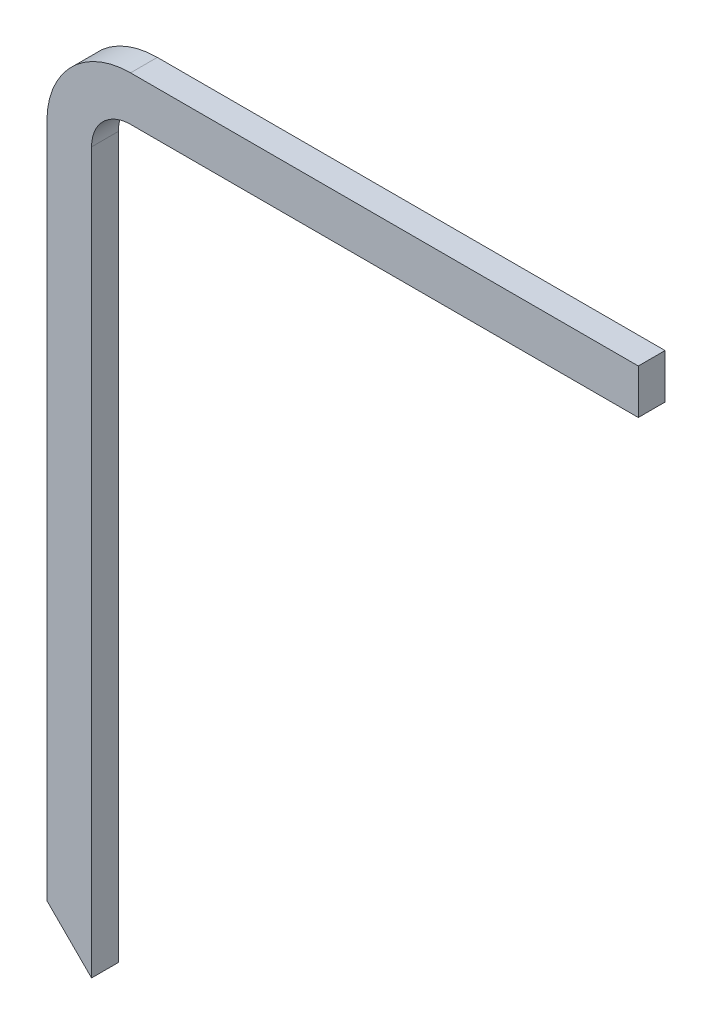
ISO-10303-21;
HEADER;
FILE_DESCRIPTION(('STEP AP214'),'2;1');
FILE_NAME('part.step','',(''),(''),'','','');
FILE_SCHEMA(('AUTOMOTIVE_DESIGN { 1 0 10303 214 1 1 1 1 }'));
ENDSEC;
DATA;
#1=APPLICATION_CONTEXT('core data for automotive mechanical design processes');
#2=APPLICATION_PROTOCOL_DEFINITION('international standard','automotive_design',2000,#1);
#3=PRODUCT_CONTEXT('',#1,'mechanical');
#4=PRODUCT('Part','Part','',(#3));
#5=PRODUCT_RELATED_PRODUCT_CATEGORY('part','',(#4));
#6=PRODUCT_DEFINITION_FORMATION('','',#4);
#7=PRODUCT_DEFINITION_CONTEXT('part definition',#1,'design');
#8=PRODUCT_DEFINITION('design','',#6,#7);
#9=PRODUCT_DEFINITION_SHAPE('','',#8);
#10=(LENGTH_UNIT() NAMED_UNIT(*) SI_UNIT(.MILLI.,.METRE.));
#11=(NAMED_UNIT(*) PLANE_ANGLE_UNIT() SI_UNIT($,.RADIAN.));
#12=(NAMED_UNIT(*) SI_UNIT($,.STERADIAN.) SOLID_ANGLE_UNIT());
#13=UNCERTAINTY_MEASURE_WITH_UNIT(LENGTH_MEASURE(1.E-05),#10,'distance_accuracy_value','');
#14=(GEOMETRIC_REPRESENTATION_CONTEXT(3) GLOBAL_UNCERTAINTY_ASSIGNED_CONTEXT((#13)) GLOBAL_UNIT_ASSIGNED_CONTEXT((#10,
#11,#12)) REPRESENTATION_CONTEXT('',''));
#15=CARTESIAN_POINT('',(0.,0.,0.));
#16=DIRECTION('',(0.,0.,1.));
#17=DIRECTION('',(1.,0.,0.));
#18=AXIS2_PLACEMENT_3D('',#15,#16,#17);
#19=CARTESIAN_POINT('',(0.,0.,6.));
#20=DIRECTION('',(-1.,0.,0.));
#21=DIRECTION('',(0.,0.,1.));
#22=AXIS2_PLACEMENT_3D('',#19,#20,#21);
#23=PLANE('',#22);
#24=DIRECTION('',(0.,1.,0.));
#25=VECTOR('',#24,1.);
#26=CARTESIAN_POINT('',(0.,0.,0.));
#27=LINE('',#26,#25);
#28=CARTESIAN_POINT('',(0.,0.,0.));
#29=VERTEX_POINT('',#28);
#30=CARTESIAN_POINT('',(0.,161.264,0.));
#31=VERTEX_POINT('',#30);
#32=EDGE_CURVE('E130',#29,#31,#27,.T.);
#33=ORIENTED_EDGE('',*,*,#32,.T.);
#34=DIRECTION('',(0.,0.,-1.));
#35=VECTOR('',#34,1.);
#36=CARTESIAN_POINT('',(0.,161.264,6.));
#37=LINE('',#36,#35);
#38=CARTESIAN_POINT('',(0.,161.264,6.));
#39=VERTEX_POINT('',#38);
#40=EDGE_CURVE('E11',#39,#31,#37,.T.);
#41=ORIENTED_EDGE('',*,*,#40,.F.);
#42=DIRECTION('',(0.,1.,0.));
#43=VECTOR('',#42,1.);
#44=CARTESIAN_POINT('',(0.,0.,6.));
#45=LINE('',#44,#43);
#46=CARTESIAN_POINT('',(0.,0.,6.));
#47=VERTEX_POINT('',#46);
#48=EDGE_CURVE('E144',#47,#39,#45,.T.);
#49=ORIENTED_EDGE('',*,*,#48,.F.);
#50=DIRECTION('',(0.,0.,-1.));
#51=VECTOR('',#50,1.);
#52=CARTESIAN_POINT('',(0.,0.,6.));
#53=LINE('',#52,#51);
#54=EDGE_CURVE('E126',#47,#29,#53,.T.);
#55=ORIENTED_EDGE('',*,*,#54,.T.);
#56=EDGE_LOOP('',(#33,#41,#49,#55));
#57=FACE_BOUND('',#56,.T.);
#58=ADVANCED_FACE('F34',(#57),#23,.F.);
#59=CARTESIAN_POINT('',(8.73599999999996,161.264,6.));
#60=DIRECTION('',(0.,0.,-1.));
#61=DIRECTION('',(-1.,0.,0.));
#62=AXIS2_PLACEMENT_3D('',#59,#60,#61);
#63=CYLINDRICAL_SURFACE('',#62,8.73599999999996);
#64=CARTESIAN_POINT('',(8.73599999999996,161.264,0.));
#65=DIRECTION('',(0.,0.,-1.));
#66=DIRECTION('',(-1.,0.,0.));
#67=AXIS2_PLACEMENT_3D('',#64,#65,#66);
#68=CIRCLE('',#67,8.73599999999996);
#69=CARTESIAN_POINT('',(8.73599999999996,170.,0.));
#70=VERTEX_POINT('',#69);
#71=EDGE_CURVE('E133',#31,#70,#68,.T.);
#72=ORIENTED_EDGE('',*,*,#71,.T.);
#73=DIRECTION('',(0.,0.,-1.));
#74=VECTOR('',#73,1.);
#75=CARTESIAN_POINT('',(8.73599999999996,170.,6.));
#76=LINE('',#75,#74);
#77=CARTESIAN_POINT('',(8.73599999999996,170.,6.));
#78=VERTEX_POINT('',#77);
#79=EDGE_CURVE('E42',#78,#70,#76,.T.);
#80=ORIENTED_EDGE('',*,*,#79,.F.);
#81=CARTESIAN_POINT('',(8.73599999999996,161.264,6.));
#82=DIRECTION('',(0.,0.,-1.));
#83=DIRECTION('',(-1.,0.,0.));
#84=AXIS2_PLACEMENT_3D('',#81,#82,#83);
#85=CIRCLE('',#84,8.73599999999996);
#86=EDGE_CURVE('E93',#39,#78,#85,.T.);
#87=ORIENTED_EDGE('',*,*,#86,.F.);
#88=ORIENTED_EDGE('',*,*,#40,.T.);
#89=EDGE_LOOP('',(#72,#80,#87,#88));
#90=FACE_BOUND('',#89,.T.);
#91=ADVANCED_FACE('F179',(#90),#63,.F.);
#92=CARTESIAN_POINT('',(8.73599999999996,170.,6.));
#93=DIRECTION('',(0.,1.,0.));
#94=DIRECTION('',(0.,0.,1.));
#95=AXIS2_PLACEMENT_3D('',#92,#93,#94);
#96=PLANE('',#95);
#97=DIRECTION('',(1.,0.,0.));
#98=VECTOR('',#97,1.);
#99=CARTESIAN_POINT('',(8.73599999999996,170.,0.));
#100=LINE('',#99,#98);
#101=CARTESIAN_POINT('',(122.5,170.,0.));
#102=VERTEX_POINT('',#101);
#103=EDGE_CURVE('E135',#70,#102,#100,.T.);
#104=ORIENTED_EDGE('',*,*,#103,.T.);
#105=DIRECTION('',(0.,0.,-1.));
#106=VECTOR('',#105,1.);
#107=CARTESIAN_POINT('',(122.5,170.,6.));
#108=LINE('',#107,#106);
#109=CARTESIAN_POINT('',(122.5,170.,6.));
#110=VERTEX_POINT('',#109);
#111=EDGE_CURVE('E151',#110,#102,#108,.T.);
#112=ORIENTED_EDGE('',*,*,#111,.F.);
#113=DIRECTION('',(1.,0.,0.));
#114=VECTOR('',#113,1.);
#115=CARTESIAN_POINT('',(8.73599999999996,170.,6.));
#116=LINE('',#115,#114);
#117=EDGE_CURVE('E159',#78,#110,#116,.T.);
#118=ORIENTED_EDGE('',*,*,#117,.F.);
#119=ORIENTED_EDGE('',*,*,#79,.T.);
#120=EDGE_LOOP('',(#104,#112,#118,#119));
#121=FACE_BOUND('',#120,.T.);
#122=ADVANCED_FACE('F157',(#121),#96,.F.);
#123=CARTESIAN_POINT('',(122.5,170.,6.));
#124=DIRECTION('',(-1.,0.,0.));
#125=DIRECTION('',(0.,0.,1.));
#126=AXIS2_PLACEMENT_3D('',#123,#124,#125);
#127=PLANE('',#126);
#128=DIRECTION('',(0.,1.,0.));
#129=VECTOR('',#128,1.);
#130=CARTESIAN_POINT('',(122.5,170.,0.));
#131=LINE('',#130,#129);
#132=CARTESIAN_POINT('',(122.5,180.,0.));
#133=VERTEX_POINT('',#132);
#134=EDGE_CURVE('E137',#102,#133,#131,.T.);
#135=ORIENTED_EDGE('',*,*,#134,.T.);
#136=DIRECTION('',(0.,0.,-1.));
#137=VECTOR('',#136,1.);
#138=CARTESIAN_POINT('',(122.5,180.,6.));
#139=LINE('',#138,#137);
#140=CARTESIAN_POINT('',(122.5,180.,6.));
#141=VERTEX_POINT('',#140);
#142=EDGE_CURVE('E148',#141,#133,#139,.T.);
#143=ORIENTED_EDGE('',*,*,#142,.F.);
#144=DIRECTION('',(0.,1.,0.));
#145=VECTOR('',#144,1.);
#146=CARTESIAN_POINT('',(122.5,170.,6.));
#147=LINE('',#146,#145);
#148=EDGE_CURVE('E171',#110,#141,#147,.T.);
#149=ORIENTED_EDGE('',*,*,#148,.F.);
#150=ORIENTED_EDGE('',*,*,#111,.T.);
#151=EDGE_LOOP('',(#135,#143,#149,#150));
#152=FACE_BOUND('',#151,.T.);
#153=ADVANCED_FACE('F167',(#152),#127,.F.);
#154=CARTESIAN_POINT('',(122.5,180.,6.));
#155=DIRECTION('',(0.,-1.,0.));
#156=DIRECTION('',(0.,0.,-1.));
#157=AXIS2_PLACEMENT_3D('',#154,#155,#156);
#158=PLANE('',#157);
#159=DIRECTION('',(-1.,0.,0.));
#160=VECTOR('',#159,1.);
#161=CARTESIAN_POINT('',(122.5,180.,0.));
#162=LINE('',#161,#160);
#163=CARTESIAN_POINT('',(8.7359999999999,180.,0.));
#164=VERTEX_POINT('',#163);
#165=EDGE_CURVE('E139',#133,#164,#162,.T.);
#166=ORIENTED_EDGE('',*,*,#165,.T.);
#167=DIRECTION('',(0.,0.,-1.));
#168=VECTOR('',#167,1.);
#169=CARTESIAN_POINT('',(8.7359999999999,180.,6.));
#170=LINE('',#169,#168);
#171=CARTESIAN_POINT('',(8.7359999999999,180.,6.));
#172=VERTEX_POINT('',#171);
#173=EDGE_CURVE('E121',#172,#164,#170,.T.);
#174=ORIENTED_EDGE('',*,*,#173,.F.);
#175=DIRECTION('',(-1.,0.,0.));
#176=VECTOR('',#175,1.);
#177=CARTESIAN_POINT('',(122.5,180.,6.));
#178=LINE('',#177,#176);
#179=EDGE_CURVE('E112',#141,#172,#178,.T.);
#180=ORIENTED_EDGE('',*,*,#179,.F.);
#181=ORIENTED_EDGE('',*,*,#142,.T.);
#182=EDGE_LOOP('',(#166,#174,#180,#181));
#183=FACE_BOUND('',#182,.T.);
#184=ADVANCED_FACE('F170',(#183),#158,.F.);
#185=CARTESIAN_POINT('',(8.7359999999999,161.264,6.));
#186=DIRECTION('',(0.,0.,-1.));
#187=DIRECTION('',(-1.,0.,0.));
#188=AXIS2_PLACEMENT_3D('',#185,#186,#187);
#189=CYLINDRICAL_SURFACE('',#188,18.7359999999999);
#190=CARTESIAN_POINT('',(8.7359999999999,161.264,0.));
#191=DIRECTION('',(0.,0.,1.));
#192=DIRECTION('',(1.,0.,0.));
#193=AXIS2_PLACEMENT_3D('',#190,#191,#192);
#194=CIRCLE('',#193,18.7359999999999);
#195=CARTESIAN_POINT('',(-10.,161.264,0.));
#196=VERTEX_POINT('',#195);
#197=EDGE_CURVE('E120',#164,#196,#194,.T.);
#198=ORIENTED_EDGE('',*,*,#197,.T.);
#199=DIRECTION('',(0.,0.,-1.));
#200=VECTOR('',#199,1.);
#201=CARTESIAN_POINT('',(-10.,161.264,6.));
#202=LINE('',#201,#200);
#203=CARTESIAN_POINT('',(-10.,161.264,6.));
#204=VERTEX_POINT('',#203);
#205=EDGE_CURVE('E117',#204,#196,#202,.T.);
#206=ORIENTED_EDGE('',*,*,#205,.F.);
#207=CARTESIAN_POINT('',(8.7359999999999,161.264,6.));
#208=DIRECTION('',(0.,0.,1.));
#209=DIRECTION('',(1.,0.,0.));
#210=AXIS2_PLACEMENT_3D('',#207,#208,#209);
#211=CIRCLE('',#210,18.7359999999999);
#212=EDGE_CURVE('E106',#172,#204,#211,.T.);
#213=ORIENTED_EDGE('',*,*,#212,.F.);
#214=ORIENTED_EDGE('',*,*,#173,.T.);
#215=EDGE_LOOP('',(#198,#206,#213,#214));
#216=FACE_BOUND('',#215,.T.);
#217=ADVANCED_FACE('F118',(#216),#189,.T.);
#218=CARTESIAN_POINT('',(-10.,161.264,6.));
#219=DIRECTION('',(1.,0.,0.));
#220=DIRECTION('',(0.,1.,0.));
#221=AXIS2_PLACEMENT_3D('',#218,#219,#220);
#222=PLANE('',#221);
#223=DIRECTION('',(0.,-1.,0.));
#224=VECTOR('',#223,1.);
#225=CARTESIAN_POINT('',(-10.,161.264,0.));
#226=LINE('',#225,#224);
#227=CARTESIAN_POINT('',(-9.99999999999999,9.99999999999999,0.));
#228=VERTEX_POINT('',#227);
#229=EDGE_CURVE('E79',#196,#228,#226,.T.);
#230=ORIENTED_EDGE('',*,*,#229,.T.);
#231=DIRECTION('',(0.,0.,-1.));
#232=VECTOR('',#231,1.);
#233=CARTESIAN_POINT('',(-9.99999999999999,9.99999999999999,6.));
#234=LINE('',#233,#232);
#235=CARTESIAN_POINT('',(-9.99999999999999,9.99999999999999,6.));
#236=VERTEX_POINT('',#235);
#237=EDGE_CURVE('E122',#236,#228,#234,.T.);
#238=ORIENTED_EDGE('',*,*,#237,.F.);
#239=DIRECTION('',(0.,-1.,0.));
#240=VECTOR('',#239,1.);
#241=CARTESIAN_POINT('',(-10.,161.264,6.));
#242=LINE('',#241,#240);
#243=EDGE_CURVE('E110',#204,#236,#242,.T.);
#244=ORIENTED_EDGE('',*,*,#243,.F.);
#245=ORIENTED_EDGE('',*,*,#205,.T.);
#246=EDGE_LOOP('',(#230,#238,#244,#245));
#247=FACE_BOUND('',#246,.T.);
#248=ADVANCED_FACE('F124',(#247),#222,.F.);
#249=CARTESIAN_POINT('',(-9.99999999999999,9.99999999999999,6.));
#250=DIRECTION('',(0.707106781186548,0.707106781186547,0.));
#251=DIRECTION('',(-0.707106781186547,0.707106781186548,0.));
#252=AXIS2_PLACEMENT_3D('',#249,#250,#251);
#253=PLANE('',#252);
#254=DIRECTION('',(0.707106781186547,-0.707106781186548,0.));
#255=VECTOR('',#254,1.);
#256=CARTESIAN_POINT('',(-9.99999999999999,9.99999999999999,0.));
#257=LINE('',#256,#255);
#258=EDGE_CURVE('E85',#228,#29,#257,.T.);
#259=ORIENTED_EDGE('',*,*,#258,.T.);
#260=ORIENTED_EDGE('',*,*,#54,.F.);
#261=DIRECTION('',(0.707106781186547,-0.707106781186548,0.));
#262=VECTOR('',#261,1.);
#263=CARTESIAN_POINT('',(-9.99999999999999,9.99999999999999,6.));
#264=LINE('',#263,#262);
#265=EDGE_CURVE('E50',#236,#47,#264,.T.);
#266=ORIENTED_EDGE('',*,*,#265,.F.);
#267=ORIENTED_EDGE('',*,*,#237,.T.);
#268=EDGE_LOOP('',(#259,#260,#266,#267));
#269=FACE_BOUND('',#268,.T.);
#270=ADVANCED_FACE('F195',(#269),#253,.F.);
#271=CARTESIAN_POINT('',(8.73599999999996,161.264,6.));
#272=DIRECTION('',(0.,0.,-1.));
#273=DIRECTION('',(-1.,0.,0.));
#274=AXIS2_PLACEMENT_3D('',#271,#272,#273);
#275=PLANE('',#274);
#276=ORIENTED_EDGE('',*,*,#48,.T.);
#277=ORIENTED_EDGE('',*,*,#86,.T.);
#278=ORIENTED_EDGE('',*,*,#117,.T.);
#279=ORIENTED_EDGE('',*,*,#148,.T.);
#280=ORIENTED_EDGE('',*,*,#179,.T.);
#281=ORIENTED_EDGE('',*,*,#212,.T.);
#282=ORIENTED_EDGE('',*,*,#243,.T.);
#283=ORIENTED_EDGE('',*,*,#265,.T.);
#284=EDGE_LOOP('',(#276,#277,#278,#279,#280,#281,#282,#283));
#285=FACE_BOUND('',#284,.T.);
#286=ADVANCED_FACE('F108',(#285),#275,.F.);
#287=CARTESIAN_POINT('',(8.73599999999996,161.264,0.));
#288=DIRECTION('',(0.,0.,-1.));
#289=DIRECTION('',(-1.,0.,0.));
#290=AXIS2_PLACEMENT_3D('',#287,#288,#289);
#291=PLANE('',#290);
#292=ORIENTED_EDGE('',*,*,#32,.F.);
#293=ORIENTED_EDGE('',*,*,#258,.F.);
#294=ORIENTED_EDGE('',*,*,#229,.F.);
#295=ORIENTED_EDGE('',*,*,#197,.F.);
#296=ORIENTED_EDGE('',*,*,#165,.F.);
#297=ORIENTED_EDGE('',*,*,#134,.F.);
#298=ORIENTED_EDGE('',*,*,#103,.F.);
#299=ORIENTED_EDGE('',*,*,#71,.F.);
#300=EDGE_LOOP('',(#292,#293,#294,#295,#296,#297,#298,#299));
#301=FACE_BOUND('',#300,.T.);
#302=ADVANCED_FACE('F163',(#301),#291,.T.);
#303=CLOSED_SHELL('',(#58,#91,#122,#153,#184,#217,#248,#270,#286,#302));
#304=MANIFOLD_SOLID_BREP('B2',#303);
#305=ADVANCED_BREP_SHAPE_REPRESENTATION('',(#18,#304),#14);
#306=SHAPE_DEFINITION_REPRESENTATION(#9,#305);
ENDSEC;
END-ISO-10303-21;
